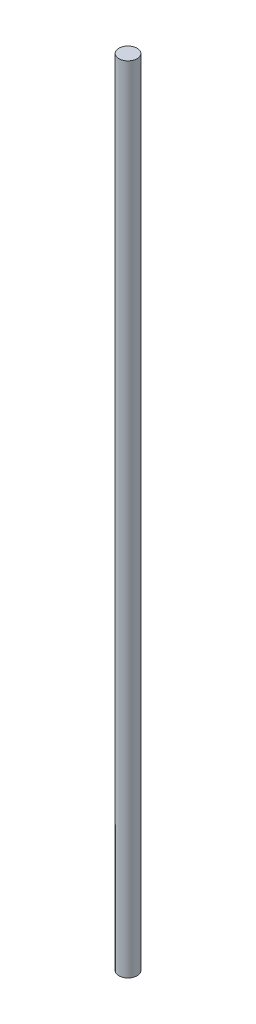
ISO-10303-21;
HEADER;
FILE_DESCRIPTION(('STEP AP214'),'2;1');
FILE_NAME('part.step','',(''),(''),'','','');
FILE_SCHEMA(('AUTOMOTIVE_DESIGN { 1 0 10303 214 1 1 1 1 }'));
ENDSEC;
DATA;
#1=APPLICATION_CONTEXT('core data for automotive mechanical design processes');
#2=APPLICATION_PROTOCOL_DEFINITION('international standard','automotive_design',2000,#1);
#3=PRODUCT_CONTEXT('',#1,'mechanical');
#4=PRODUCT('Part','Part','',(#3));
#5=PRODUCT_RELATED_PRODUCT_CATEGORY('part','',(#4));
#6=PRODUCT_DEFINITION_FORMATION('','',#4);
#7=PRODUCT_DEFINITION_CONTEXT('part definition',#1,'design');
#8=PRODUCT_DEFINITION('design','',#6,#7);
#9=PRODUCT_DEFINITION_SHAPE('','',#8);
#10=(LENGTH_UNIT() NAMED_UNIT(*) SI_UNIT(.MILLI.,.METRE.));
#11=(NAMED_UNIT(*) PLANE_ANGLE_UNIT() SI_UNIT($,.RADIAN.));
#12=(NAMED_UNIT(*) SI_UNIT($,.STERADIAN.) SOLID_ANGLE_UNIT());
#13=UNCERTAINTY_MEASURE_WITH_UNIT(LENGTH_MEASURE(1.E-05),#10,'distance_accuracy_value','');
#14=(GEOMETRIC_REPRESENTATION_CONTEXT(3) GLOBAL_UNCERTAINTY_ASSIGNED_CONTEXT((#13)) GLOBAL_UNIT_ASSIGNED_CONTEXT((#10,
#11,#12)) REPRESENTATION_CONTEXT('',''));
#15=CARTESIAN_POINT('',(0.,0.,0.));
#16=DIRECTION('',(0.,0.,1.));
#17=DIRECTION('',(1.,0.,0.));
#18=AXIS2_PLACEMENT_3D('',#15,#16,#17);
#19=CARTESIAN_POINT('',(0.,523.25,0.));
#20=DIRECTION('',(0.,-1.,0.));
#21=DIRECTION('',(0.,0.,-1.));
#22=AXIS2_PLACEMENT_3D('',#19,#20,#21);
#23=CYLINDRICAL_SURFACE('',#22,6.);
#24=CARTESIAN_POINT('',(0.,523.25,0.));
#25=DIRECTION('',(0.,1.,0.));
#26=DIRECTION('',(0.,0.,1.));
#27=AXIS2_PLACEMENT_3D('',#24,#25,#26);
#28=CIRCLE('',#27,6.);
#29=CARTESIAN_POINT('',(0.,523.25,6.));
#30=VERTEX_POINT('',#29);
#31=EDGE_CURVE('E10',#30,#30,#28,.T.);
#32=ORIENTED_EDGE('',*,*,#31,.F.);
#33=EDGE_LOOP('',(#32));
#34=FACE_BOUND('',#33,.T.);
#35=CARTESIAN_POINT('',(0.,0.,0.));
#36=DIRECTION('',(0.,1.,0.));
#37=DIRECTION('',(0.,0.,1.));
#38=AXIS2_PLACEMENT_3D('',#35,#36,#37);
#39=CIRCLE('',#38,6.);
#40=CARTESIAN_POINT('',(0.,0.,6.));
#41=VERTEX_POINT('',#40);
#42=EDGE_CURVE('E36',#41,#41,#39,.T.);
#43=ORIENTED_EDGE('',*,*,#42,.T.);
#44=EDGE_LOOP('',(#43));
#45=FACE_BOUND('',#44,.T.);
#46=ADVANCED_FACE('F33',(#34,#45),#23,.T.);
#47=CARTESIAN_POINT('',(0.,523.25,0.));
#48=DIRECTION('',(0.,1.,0.));
#49=DIRECTION('',(0.,0.,1.));
#50=AXIS2_PLACEMENT_3D('',#47,#48,#49);
#51=PLANE('',#50);
#52=ORIENTED_EDGE('',*,*,#31,.T.);
#53=EDGE_LOOP('',(#52));
#54=FACE_BOUND('',#53,.T.);
#55=ADVANCED_FACE('F48',(#54),#51,.T.);
#56=CARTESIAN_POINT('',(0.,0.,0.));
#57=DIRECTION('',(0.,1.,0.));
#58=DIRECTION('',(0.,0.,1.));
#59=AXIS2_PLACEMENT_3D('',#56,#57,#58);
#60=PLANE('',#59);
#61=ORIENTED_EDGE('',*,*,#42,.F.);
#62=EDGE_LOOP('',(#61));
#63=FACE_BOUND('',#62,.T.);
#64=ADVANCED_FACE('F46',(#63),#60,.F.);
#65=CLOSED_SHELL('',(#46,#55,#64));
#66=MANIFOLD_SOLID_BREP('B2',#65);
#67=ADVANCED_BREP_SHAPE_REPRESENTATION('',(#18,#66),#14);
#68=SHAPE_DEFINITION_REPRESENTATION(#9,#67);
ENDSEC;
END-ISO-10303-21;
